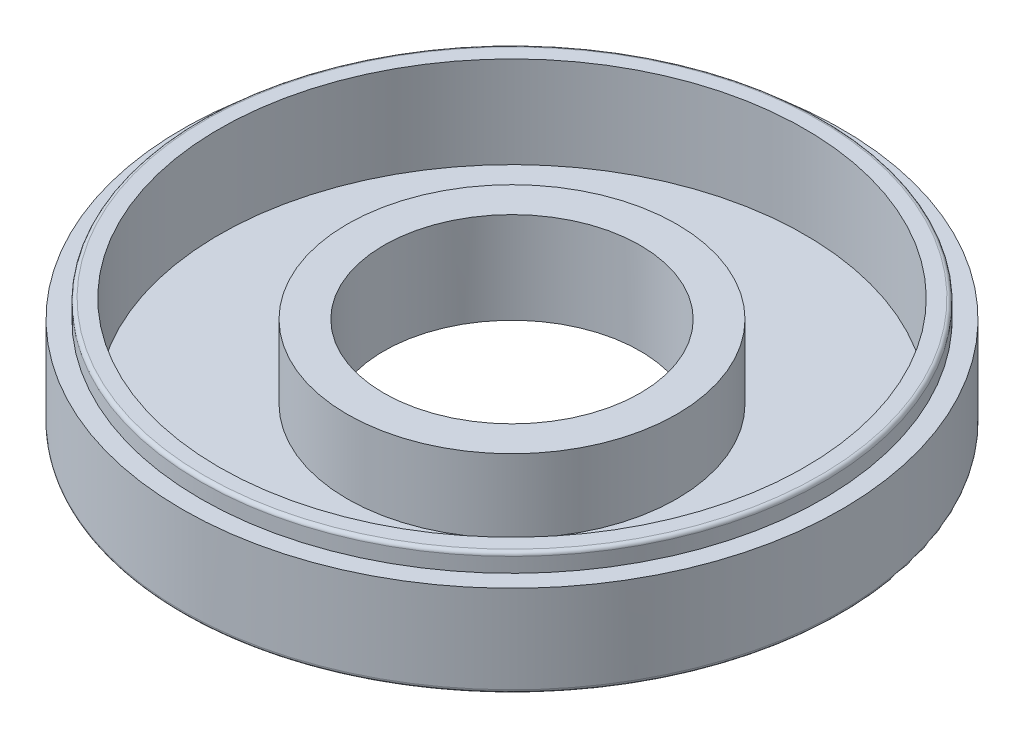
ISO-10303-21;
HEADER;
FILE_DESCRIPTION(('STEP AP214'),'2;1');
FILE_NAME('part.step','',(''),(''),'','','');
FILE_SCHEMA(('AUTOMOTIVE_DESIGN { 1 0 10303 214 1 1 1 1 }'));
ENDSEC;
DATA;
#1=APPLICATION_CONTEXT('core data for automotive mechanical design processes');
#2=APPLICATION_PROTOCOL_DEFINITION('international standard','automotive_design',2000,#1);
#3=PRODUCT_CONTEXT('',#1,'mechanical');
#4=PRODUCT('Part','Part','',(#3));
#5=PRODUCT_RELATED_PRODUCT_CATEGORY('part','',(#4));
#6=PRODUCT_DEFINITION_FORMATION('','',#4);
#7=PRODUCT_DEFINITION_CONTEXT('part definition',#1,'design');
#8=PRODUCT_DEFINITION('design','',#6,#7);
#9=PRODUCT_DEFINITION_SHAPE('','',#8);
#10=(LENGTH_UNIT() NAMED_UNIT(*) SI_UNIT(.MILLI.,.METRE.));
#11=(NAMED_UNIT(*) PLANE_ANGLE_UNIT() SI_UNIT($,.RADIAN.));
#12=(NAMED_UNIT(*) SI_UNIT($,.STERADIAN.) SOLID_ANGLE_UNIT());
#13=UNCERTAINTY_MEASURE_WITH_UNIT(LENGTH_MEASURE(1.E-05),#10,'distance_accuracy_value','');
#14=(GEOMETRIC_REPRESENTATION_CONTEXT(3) GLOBAL_UNCERTAINTY_ASSIGNED_CONTEXT((#13)) GLOBAL_UNIT_ASSIGNED_CONTEXT((#10,
#11,#12)) REPRESENTATION_CONTEXT('',''));
#15=CARTESIAN_POINT('',(0.,0.,0.));
#16=DIRECTION('',(0.,0.,1.));
#17=DIRECTION('',(1.,0.,0.));
#18=AXIS2_PLACEMENT_3D('',#15,#16,#17);
#19=CARTESIAN_POINT('',(0.,5.,0.));
#20=DIRECTION('',(0.,1.,0.));
#21=DIRECTION('',(0.,0.,1.));
#22=AXIS2_PLACEMENT_3D('',#19,#20,#21);
#23=CYLINDRICAL_SURFACE('',#22,44.9999999999995);
#24=CARTESIAN_POINT('',(0.,5.,0.));
#25=DIRECTION('',(0.,1.,0.));
#26=DIRECTION('',(0.,0.,1.));
#27=AXIS2_PLACEMENT_3D('',#24,#25,#26);
#28=CIRCLE('',#27,44.9999999999995);
#29=CARTESIAN_POINT('',(0.,5.,44.9999999999995));
#30=VERTEX_POINT('',#29);
#31=EDGE_CURVE('E122',#30,#30,#28,.T.);
#32=ORIENTED_EDGE('',*,*,#31,.T.);
#33=EDGE_LOOP('',(#32));
#34=FACE_BOUND('',#33,.T.);
#35=CARTESIAN_POINT('',(0.,25.,0.));
#36=DIRECTION('',(0.,1.,0.));
#37=DIRECTION('',(0.,0.,1.));
#38=AXIS2_PLACEMENT_3D('',#35,#36,#37);
#39=CIRCLE('',#38,44.9999999999995);
#40=CARTESIAN_POINT('',(0.,25.,44.9999999999995));
#41=VERTEX_POINT('',#40);
#42=EDGE_CURVE('E341',#41,#41,#39,.T.);
#43=ORIENTED_EDGE('',*,*,#42,.F.);
#44=EDGE_LOOP('',(#43));
#45=FACE_BOUND('',#44,.T.);
#46=ADVANCED_FACE('F51',(#34,#45),#23,.T.);
#47=CARTESIAN_POINT('',(2.32906465773737E-13,0.,2.17976899552867E-13));
#48=DIRECTION('',(0.,1.,0.));
#49=DIRECTION('',(0.,0.,1.));
#50=AXIS2_PLACEMENT_3D('',#47,#48,#49);
#51=CYLINDRICAL_SURFACE('',#50,34.9999999999991);
#52=CARTESIAN_POINT('',(2.32906465773737E-13,0.,2.17976899552867E-13));
#53=DIRECTION('',(0.,1.,0.));
#54=DIRECTION('',(0.,0.,1.));
#55=AXIS2_PLACEMENT_3D('',#52,#53,#54);
#56=CIRCLE('',#55,34.9999999999991);
#57=CARTESIAN_POINT('',(12.3951127626702,0.,-32.7316540920348));
#58=VERTEX_POINT('',#57);
#59=CARTESIAN_POINT('',(21.1450849832288,0.,-27.8905966420937));
#60=VERTEX_POINT('',#59);
#61=EDGE_CURVE('E112',#58,#60,#56,.T.);
#62=ORIENTED_EDGE('',*,*,#61,.F.);
#63=CARTESIAN_POINT('',(12.3951127626702,0.,-32.7316540920348));
#64=CARTESIAN_POINT('',(12.4484687607722,0.129276029627937,-32.7114457014059));
#65=CARTESIAN_POINT('',(12.5069391301364,0.256109112763818,-32.6891575529408));
#66=CARTESIAN_POINT('',(12.6335263452166,0.504022596320164,-32.6404451988197));
#67=CARTESIAN_POINT('',(12.7016422688342,0.625103545158873,-32.6140213885005));
#68=CARTESIAN_POINT('',(12.8468862104048,0.860569624154438,-32.5570818136111));
#69=CARTESIAN_POINT('',(12.9240064214296,0.974960427533291,-32.5265695904514));
#70=CARTESIAN_POINT('',(13.0866502314094,1.19637135688397,-32.46147346742));
#71=CARTESIAN_POINT('',(13.1721738385527,1.30339147567369,-32.4268895635811));
#72=CARTESIAN_POINT('',(13.3509197225474,1.50932310890023,-32.3537055861148));
#73=CARTESIAN_POINT('',(13.4441420558626,1.60823456385595,-32.3151054830314));
#74=CARTESIAN_POINT('',(13.637563700141,1.79729730739995,-32.2339550317877));
#75=CARTESIAN_POINT('',(13.7377654196398,1.88744554589833,-32.1914033182501));
#76=CARTESIAN_POINT('',(13.9443157931492,2.05831120722936,-32.10247181742));
#77=CARTESIAN_POINT('',(14.0506642287738,2.13902896480926,-32.0560921661048));
#78=CARTESIAN_POINT('',(14.2686756315274,2.29046670135772,-31.959648006746));
#79=CARTESIAN_POINT('',(14.3803385741531,2.36118672641653,-31.9095835156915));
#80=CARTESIAN_POINT('',(14.6084395089449,2.49230925651385,-31.8058050914774));
#81=CARTESIAN_POINT('',(14.7248902973485,2.55268153765926,-31.7520810873598));
#82=CARTESIAN_POINT('',(14.9613206565005,2.66239453176221,-31.6413639934016));
#83=CARTESIAN_POINT('',(15.0812989455342,2.71173919688736,-31.5843720839711));
#84=CARTESIAN_POINT('',(15.3238110915084,2.79901985339384,-31.4674263339365));
#85=CARTESIAN_POINT('',(15.4463430044665,2.83696420691504,-31.4074747020597));
#86=CARTESIAN_POINT('',(15.6930683051028,2.90118785194441,-31.2849256611057));
#87=CARTESIAN_POINT('',(15.8172609734952,2.92747203510712,-31.2223293736036));
#88=CARTESIAN_POINT('',(16.0481263762499,2.96519955668064,-31.1042100398117));
#89=CARTESIAN_POINT('',(16.1546970406201,2.9782542023827,-31.0489961829017));
#90=CARTESIAN_POINT('',(16.3676235476797,2.99565020992801,-30.9372818413949));
#91=CARTESIAN_POINT('',(16.4739794249956,3.00000755217866,-30.8807839097778));
#92=CARTESIAN_POINT('',(16.5800446336454,3.,-30.823726574609));
#93=B_SPLINE_CURVE_WITH_KNOTS('',3,(#63,#64,#65,#66,#67,#68,#69,#70,#71,#72,#73,#74,#75,#76,#77,
#78,#79,#80,#81,#82,#83,#84,#85,#86,#87,#88,#89,#90,#91,#92),.UNSPECIFIED.,.F.,.F.,(4,2,2,2,2,2,
2,2,2,2,2,2,2,2,4),(0.,0.423783034847252,0.847525584077967,1.27090342932024,1.694281687102,
2.11766305029728,2.54119125021047,2.96470441186563,3.38821562103129,3.81294349598829,
4.23751890850186,4.66178212992629,5.08586719647,5.447750024582,5.80896731558725),.UNSPECIFIED.);
#94=CARTESIAN_POINT('',(16.5800446336454,3.,-30.8237265746091));
#95=VERTEX_POINT('',#94);
#96=EDGE_CURVE('E318',#58,#95,#93,.T.);
#97=ORIENTED_EDGE('',*,*,#96,.T.);
#98=CARTESIAN_POINT('',(2.32906465773737E-13,3.,2.17976899552867E-13));
#99=DIRECTION('',(0.,1.,0.));
#100=DIRECTION('',(0.,0.,1.));
#101=AXIS2_PLACEMENT_3D('',#98,#99,#100);
#102=CIRCLE('',#101,34.9999999999991);
#103=CARTESIAN_POINT('',(17.3101715288134,3.,-30.4196969354232));
#104=VERTEX_POINT('',#103);
#105=EDGE_CURVE('E115',#95,#104,#102,.F.);
#106=ORIENTED_EDGE('',*,*,#105,.T.);
#107=CARTESIAN_POINT('',(17.3101715288134,3.,-30.4196969354232));
#108=CARTESIAN_POINT('',(17.4317974113366,3.00001589154164,-30.3504960209399));
#109=CARTESIAN_POINT('',(17.5529971504541,2.99412630081632,-30.2805530293558));
#110=CARTESIAN_POINT('',(17.7936975098551,2.97065351130556,-30.1397347605757));
#111=CARTESIAN_POINT('',(17.9131982752654,2.95307131750916,-30.0688595640167));
#112=CARTESIAN_POINT('',(18.1495282673635,2.90635965277069,-29.9268048996756));
#113=CARTESIAN_POINT('',(18.2663606263249,2.87724454363991,-29.8556259188366));
#114=CARTESIAN_POINT('',(18.4967219689307,2.80769146021013,-29.7134579929941));
#115=CARTESIAN_POINT('',(18.6102509706042,2.76725354772168,-29.6424690469554));
#116=CARTESIAN_POINT('',(18.833267829299,2.67535243401299,-29.5012787196624));
#117=CARTESIAN_POINT('',(18.9427555805255,2.62388894439648,-29.4310773590595));
#118=CARTESIAN_POINT('',(19.1570326287485,2.51029348948365,-29.2920538450206));
#119=CARTESIAN_POINT('',(19.2618202751615,2.44815781275293,-29.223232180727));
#120=CARTESIAN_POINT('',(19.4660193003271,2.31367348106804,-29.0876110820252));
#121=CARTESIAN_POINT('',(19.5654304592959,2.24132440903957,-29.0208117303356));
#122=CARTESIAN_POINT('',(19.7582824302941,2.08692563888873,-28.8898574470994));
#123=CARTESIAN_POINT('',(19.8517231949357,2.00487586378555,-28.8257025365435));
#124=CARTESIAN_POINT('',(20.0327346164249,1.83103153301315,-28.70020489425));
#125=CARTESIAN_POINT('',(20.1202589021726,1.73917194581539,-28.6388853542292));
#126=CARTESIAN_POINT('',(20.2881735738181,1.5468672569121,-28.5201785362313));
#127=CARTESIAN_POINT('',(20.3685663968752,1.44642511149186,-28.4627899164116));
#128=CARTESIAN_POINT('',(20.5217500581114,1.23769088256299,-28.3525426990866));
#129=CARTESIAN_POINT('',(20.5945456957124,1.12940382913542,-28.299681245437));
#130=CARTESIAN_POINT('',(20.7321630732249,0.905710881475214,-28.1990191142171));
#131=CARTESIAN_POINT('',(20.7969879121352,0.7903077802893,-28.1512164708252));
#132=CARTESIAN_POINT('',(20.9125507838426,0.564447709493236,-28.0654574886167));
#133=CARTESIAN_POINT('',(20.9640424432558,0.454566482893431,-28.0269969878339));
#134=CARTESIAN_POINT('',(21.0599122468518,0.230440501066544,-27.9550289898252));
#135=CARTESIAN_POINT('',(21.1043034795711,0.11620426665345,-27.9215123883756));
#136=CARTESIAN_POINT('',(21.1450849832288,0.,-27.8905966420937));
#137=B_SPLINE_CURVE_WITH_KNOTS('',3,(#107,#108,#109,#110,#111,#112,#113,#114,#115,#116,#117,
#118,#119,#120,#121,#122,#123,#124,#125,#126,#127,#128,#129,#130,#131,#132,#133,#134,#135,#136),
.UNSPECIFIED.,.F.,.F.,(4,2,2,2,2,2,2,2,2,2,2,2,2,2,4),(0.,0.419671653961475,0.839307241452767,
1.25842189600554,1.67753426267957,2.09665759342365,2.51592697765006,2.93521348812029,
3.3545033260997,3.77676913065431,4.19889006646679,4.62074269781777,5.0424307932698,
5.42395655795063,5.8047707258094),.UNSPECIFIED.);
#138=EDGE_CURVE('E102',#104,#60,#137,.T.);
#139=ORIENTED_EDGE('',*,*,#138,.T.);
#140=EDGE_LOOP('',(#62,#97,#106,#139));
#141=FACE_BOUND('',#140,.T.);
#142=CARTESIAN_POINT('',(2.32906465773737E-13,25.,2.17976899552867E-13));
#143=DIRECTION('',(0.,1.,0.));
#144=DIRECTION('',(0.,0.,1.));
#145=AXIS2_PLACEMENT_3D('',#142,#143,#144);
#146=CIRCLE('',#145,34.9999999999991);
#147=CARTESIAN_POINT('',(2.32906465773737E-13,25.,34.9999999999994));
#148=VERTEX_POINT('',#147);
#149=EDGE_CURVE('E55',#148,#148,#146,.F.);
#150=ORIENTED_EDGE('',*,*,#149,.F.);
#151=EDGE_LOOP('',(#150));
#152=FACE_BOUND('',#151,.T.);
#153=ADVANCED_FACE('F110',(#141,#152),#51,.F.);
#154=CARTESIAN_POINT('',(0.,30.,0.));
#155=DIRECTION('',(0.,-1.,0.));
#156=DIRECTION('',(0.,0.,-1.));
#157=AXIS2_PLACEMENT_3D('',#154,#155,#156);
#158=CYLINDRICAL_SURFACE('',#157,90.);
#159=CARTESIAN_POINT('',(43.5822055319173,3.,-78.7438337965184));
#160=CARTESIAN_POINT('',(43.4592223692715,3.00001523579065,-78.8119048537251));
#161=CARTESIAN_POINT('',(43.3360787169811,2.9940734299319,-78.8796809012287));
#162=CARTESIAN_POINT('',(43.0903599479878,2.97038721251025,-79.0141780664588));
#163=CARTESIAN_POINT('',(42.9677848009455,2.95264343825288,-79.0808992409492));
#164=CARTESIAN_POINT('',(42.7241870056725,2.90548563142727,-79.2127707779764));
#165=CARTESIAN_POINT('',(42.6031630786038,2.87608194864949,-79.2779224793818));
#166=CARTESIAN_POINT('',(42.363434518466,2.80582093005223,-79.4062837062947));
#167=CARTESIAN_POINT('',(42.2447298568596,2.76496373525749,-79.469493255705));
#168=CARTESIAN_POINT('',(42.0104804338637,2.6720783190651,-79.5935745471903));
#169=CARTESIAN_POINT('',(41.894936266597,2.62004801335091,-79.6544458505701));
#170=CARTESIAN_POINT('',(41.6678373635025,2.50517273736847,-79.773477874379));
#171=CARTESIAN_POINT('',(41.5562840295407,2.44232401108702,-79.831637644457));
#172=CARTESIAN_POINT('',(41.3380398896138,2.30627741058074,-79.9448658290049));
#173=CARTESIAN_POINT('',(41.2313486846048,2.23308038768926,-79.9999344972533));
#174=CARTESIAN_POINT('',(41.0236090537988,2.07685281801269,-80.1066610179069));
#175=CARTESIAN_POINT('',(40.9225606350811,1.9938222588909,-80.1583188660329));
#176=CARTESIAN_POINT('',(40.7266893232019,1.81836333246364,-80.2580144086565));
#177=CARTESIAN_POINT('',(40.6318775396095,1.72591890421697,-80.3060456643149));
#178=CARTESIAN_POINT('',(40.449416237118,1.53244161665669,-80.3981042494095));
#179=CARTESIAN_POINT('',(40.3617642287486,1.43141176765805,-80.4421329711424));
#180=CARTESIAN_POINT('',(40.1943009159083,1.22151762689052,-80.5259395426686));
#181=CARTESIAN_POINT('',(40.1144847817111,1.11265823355949,-80.5657200122627));
#182=CARTESIAN_POINT('',(39.9632651947625,0.887859678786872,-80.6408367982721));
#183=CARTESIAN_POINT('',(39.8918584039291,0.771923354463618,-80.6761748784686));
#184=CARTESIAN_POINT('',(39.7661912743911,0.548379638195814,-80.7381838457865));
#185=CARTESIAN_POINT('',(39.7109021168373,0.441495788376737,-80.7653861724415));
#186=CARTESIAN_POINT('',(39.6076101712924,0.223680391153764,-80.8160905157932));
#187=CARTESIAN_POINT('',(39.5595935488308,0.112757039891572,-80.8395995614388));
#188=CARTESIAN_POINT('',(39.5153114194194,0.,-80.861240179868));
#189=B_SPLINE_CURVE_WITH_KNOTS('',3,(#159,#160,#161,#162,#163,#164,#165,#166,#167,#168,#169,
#170,#171,#172,#173,#174,#175,#176,#177,#178,#179,#180,#181,#182,#183,#184,#185,#186,#187,#188),
.UNSPECIFIED.,.F.,.F.,(4,2,2,2,2,2,2,2,2,2,2,2,2,2,4),(0.,0.421565690964689,0.843108619257232,
1.26427820415102,1.68544260349847,2.10668563839326,2.52807521939633,2.94943015368533,
3.37078561659221,3.79287239416483,4.21481178088336,4.63648944604644,5.05799915835359,
5.42778864140511,5.79686559538389),.UNSPECIFIED.);
#190=CARTESIAN_POINT('',(43.5822055319173,3.,-78.7438337965184));
#191=VERTEX_POINT('',#190);
#192=CARTESIAN_POINT('',(40.0387008008399,1.00000000000001,-80.6033649308813));
#193=VERTEX_POINT('',#192);
#194=EDGE_CURVE('E309',#191,#193,#189,.T.);
#195=ORIENTED_EDGE('',*,*,#194,.T.);
#196=CARTESIAN_POINT('',(0.,1.,0.));
#197=DIRECTION('',(0.,1.,0.));
#198=DIRECTION('',(0.,0.,1.));
#199=AXIS2_PLACEMENT_3D('',#196,#197,#198);
#200=CIRCLE('',#199,90.);
#201=CARTESIAN_POINT('',(47.7481320788545,0.999999999999994,-76.2896839879434));
#202=VERTEX_POINT('',#201);
#203=EDGE_CURVE('E180',#193,#202,#200,.T.);
#204=ORIENTED_EDGE('',*,*,#203,.T.);
#205=CARTESIAN_POINT('',(48.2415563893468,0.,-75.9786301346206));
#206=CARTESIAN_POINT('',(48.1939954371257,0.128944274670405,-76.0088269028136));
#207=CARTESIAN_POINT('',(48.1417889855804,0.255494803599767,-76.0419133850985));
#208=CARTESIAN_POINT('',(48.028475338156,0.502935024862477,-76.1135342989408));
#209=CARTESIAN_POINT('',(47.9673686074365,0.623825012599301,-76.1520684457813));
#210=CARTESIAN_POINT('',(47.8366927460156,0.858988829159912,-76.2342230250002));
#211=CARTESIAN_POINT('',(47.7671305355399,0.97326795694504,-76.2778392968158));
#212=CARTESIAN_POINT('',(47.6199639118232,1.19450829013831,-76.3698014084832));
#213=CARTESIAN_POINT('',(47.5423595972649,1.3014695853152,-76.4181471902998));
#214=CARTESIAN_POINT('',(47.3796006885557,1.50733866120852,-76.5191649852966));
#215=CARTESIAN_POINT('',(47.2944445848305,1.60624482411975,-76.5718378632913));
#216=CARTESIAN_POINT('',(47.1171271581299,1.79531212271054,-76.6810744125435));
#217=CARTESIAN_POINT('',(47.0249634097839,1.88547020584917,-76.7376394302346));
#218=CARTESIAN_POINT('',(46.8342793071827,2.05635352251867,-76.8541655495134));
#219=CARTESIAN_POINT('',(46.7357596114886,2.13707973088915,-76.9141262991795));
#220=CARTESIAN_POINT('',(46.5330147876899,2.28853616865751,-77.0369559382531));
#221=CARTESIAN_POINT('',(46.4287896638053,2.35926640544865,-77.0998248255097));
#222=CARTESIAN_POINT('',(46.2152534027695,2.49027855304082,-77.2280122107303));
#223=CARTESIAN_POINT('',(46.1059383268676,2.55055219588806,-77.2933325978912));
#224=CARTESIAN_POINT('',(45.8830828203332,2.66013253214132,-77.4258323054388));
#225=CARTESIAN_POINT('',(45.76954388819,2.70944307240144,-77.4930109644414));
#226=CARTESIAN_POINT('',(45.5390590749425,2.79674296341114,-77.6286800558804));
#227=CARTESIAN_POINT('',(45.422115371808,2.83473938420617,-77.6971696405352));
#228=CARTESIAN_POINT('',(45.1856067316215,2.8991679923754,-77.8349514638489));
#229=CARTESIAN_POINT('',(45.0660428655311,2.92560481532419,-77.9042433693012));
#230=CARTESIAN_POINT('',(44.8405738667903,2.96410046656182,-78.0342079235404));
#231=CARTESIAN_POINT('',(44.7348864522342,2.97756971180497,-78.0948447368368));
#232=CARTESIAN_POINT('',(44.522897210274,2.99551470573675,-78.2158972336989));
#233=CARTESIAN_POINT('',(44.4165969613313,3.00000775268973,-78.276313118192));
#234=CARTESIAN_POINT('',(44.310165749441,3.,-78.3365126314484));
#235=B_SPLINE_CURVE_WITH_KNOTS('',3,(#205,#206,#207,#208,#209,#210,#211,#212,#213,#214,#215,
#216,#217,#218,#219,#220,#221,#222,#223,#224,#225,#226,#227,#228,#229,#230,#231,#232,#233,#234),
.UNSPECIFIED.,.F.,.F.,(4,2,2,2,2,2,2,2,2,2,2,2,2,2,4),(0.,0.422013213789404,0.84400437961119,
1.26565247130344,1.68729538965928,2.10902278366045,2.53089680929488,2.95272719312918,
3.37455726496596,3.79671936952457,4.21873310658122,4.6404825766661,5.0620627633385,
5.42950457038345,5.79623758509501),.UNSPECIFIED.);
#236=CARTESIAN_POINT('',(44.310165749441,3.,-78.3365126314484));
#237=VERTEX_POINT('',#236);
#238=EDGE_CURVE('E117',#202,#237,#235,.T.);
#239=ORIENTED_EDGE('',*,*,#238,.T.);
#240=CARTESIAN_POINT('',(0.,3.,0.));
#241=DIRECTION('',(0.,1.,0.));
#242=DIRECTION('',(0.,0.,1.));
#243=AXIS2_PLACEMENT_3D('',#240,#241,#242);
#244=CIRCLE('',#243,90.);
#245=EDGE_CURVE('E314',#237,#191,#244,.T.);
#246=ORIENTED_EDGE('',*,*,#245,.T.);
#247=EDGE_LOOP('',(#195,#204,#239,#246));
#248=FACE_BOUND('',#247,.T.);
#249=CARTESIAN_POINT('',(-1.48353551665537E-11,25.,-1.2490009027033E-13));
#250=DIRECTION('',(0.,1.,0.));
#251=DIRECTION('',(0.,0.,1.));
#252=AXIS2_PLACEMENT_3D('',#249,#250,#251);
#253=CIRCLE('',#252,89.9999999999917);
#254=CARTESIAN_POINT('',(-1.48353551665537E-11,25.,89.9999999999915));
#255=VERTEX_POINT('',#254);
#256=EDGE_CURVE('E123',#255,#255,#253,.T.);
#257=ORIENTED_EDGE('',*,*,#256,.F.);
#258=EDGE_LOOP('',(#257));
#259=FACE_BOUND('',#258,.T.);
#260=ADVANCED_FACE('F166',(#248,#259),#158,.T.);
#261=CARTESIAN_POINT('',(0.,30.,0.));
#262=DIRECTION('',(0.,1.,0.));
#263=DIRECTION('',(0.,0.,1.));
#264=AXIS2_PLACEMENT_3D('',#261,#262,#263);
#265=PLANE('',#264);
#266=CARTESIAN_POINT('',(-1.48353551665537E-11,30.,-1.2490009027033E-13));
#267=DIRECTION('',(0.,1.,0.));
#268=DIRECTION('',(0.,0.,1.));
#269=AXIS2_PLACEMENT_3D('',#266,#267,#268);
#270=CIRCLE('',#269,83.9999999999852);
#271=CARTESIAN_POINT('',(-1.48353551665537E-11,30.,83.9999999999851));
#272=VERTEX_POINT('',#271);
#273=EDGE_CURVE('E61',#272,#272,#270,.T.);
#274=ORIENTED_EDGE('',*,*,#273,.T.);
#275=EDGE_LOOP('',(#274));
#276=FACE_BOUND('',#275,.T.);
#277=CARTESIAN_POINT('',(0.,30.,0.));
#278=DIRECTION('',(0.,1.,0.));
#279=DIRECTION('',(0.,0.,1.));
#280=AXIS2_PLACEMENT_3D('',#277,#278,#279);
#281=CIRCLE('',#280,80.);
#282=CARTESIAN_POINT('',(0.,30.,80.));
#283=VERTEX_POINT('',#282);
#284=EDGE_CURVE('E128',#283,#283,#281,.T.);
#285=ORIENTED_EDGE('',*,*,#284,.F.);
#286=EDGE_LOOP('',(#285));
#287=FACE_BOUND('',#286,.T.);
#288=ADVANCED_FACE('F199',(#276,#287),#265,.T.);
#289=CARTESIAN_POINT('',(0.,0.,0.));
#290=DIRECTION('',(0.,1.,0.));
#291=DIRECTION('',(0.,0.,1.));
#292=AXIS2_PLACEMENT_3D('',#289,#290,#291);
#293=PLANE('',#292);
#294=DIRECTION('',(-0.490907288805725,0.,0.871211819133219));
#295=VECTOR('',#294,1.);
#296=CARTESIAN_POINT('',(52.0070291612452,0.,-82.6612043361222));
#297=LINE('',#296,#295);
#298=CARTESIAN_POINT('',(47.7499620353006,0.,-75.1061989826895));
#299=VERTEX_POINT('',#298);
#300=EDGE_CURVE('E98',#299,#60,#297,.T.);
#301=ORIENTED_EDGE('',*,*,#300,.F.);
#302=CARTESIAN_POINT('',(0.,0.,0.));
#303=DIRECTION('',(0.,1.,0.));
#304=DIRECTION('',(0.,0.,1.));
#305=AXIS2_PLACEMENT_3D('',#302,#303,#304);
#306=CIRCLE('',#305,89.);
#307=CARTESIAN_POINT('',(39.0235466689867,0.,-79.9885167094216));
#308=VERTEX_POINT('',#307);
#309=EDGE_CURVE('E68',#299,#308,#306,.F.);
#310=ORIENTED_EDGE('',*,*,#309,.T.);
#311=DIRECTION('',(0.49091159386535,0.,-0.871209393319759));
#312=VECTOR('',#311,1.);
#313=CARTESIAN_POINT('',(43.3347077303076,0.,-87.6394340225852));
#314=LINE('',#313,#312);
#315=EDGE_CURVE('E106',#58,#308,#314,.T.);
#316=ORIENTED_EDGE('',*,*,#315,.F.);
#317=ORIENTED_EDGE('',*,*,#61,.T.);
#318=EDGE_LOOP('',(#301,#310,#316,#317));
#319=FACE_BOUND('',#318,.T.);
#320=ADVANCED_FACE('F120',(#319),#293,.F.);
#321=CARTESIAN_POINT('',(0.,5.,0.));
#322=DIRECTION('',(0.,1.,0.));
#323=DIRECTION('',(0.,0.,1.));
#324=AXIS2_PLACEMENT_3D('',#321,#322,#323);
#325=CYLINDRICAL_SURFACE('',#324,80.);
#326=CARTESIAN_POINT('',(0.,5.,0.));
#327=DIRECTION('',(0.,1.,0.));
#328=DIRECTION('',(0.,0.,1.));
#329=AXIS2_PLACEMENT_3D('',#326,#327,#328);
#330=CIRCLE('',#329,80.);
#331=CARTESIAN_POINT('',(0.,5.,80.));
#332=VERTEX_POINT('',#331);
#333=EDGE_CURVE('E135',#332,#332,#330,.T.);
#334=ORIENTED_EDGE('',*,*,#333,.F.);
#335=EDGE_LOOP('',(#334));
#336=FACE_BOUND('',#335,.T.);
#337=ORIENTED_EDGE('',*,*,#284,.T.);
#338=EDGE_LOOP('',(#337));
#339=FACE_BOUND('',#338,.T.);
#340=ADVANCED_FACE('F223',(#336,#339),#325,.F.);
#341=CARTESIAN_POINT('',(0.,5.,0.));
#342=DIRECTION('',(0.,1.,0.));
#343=DIRECTION('',(0.,0.,1.));
#344=AXIS2_PLACEMENT_3D('',#341,#342,#343);
#345=PLANE('',#344);
#346=ORIENTED_EDGE('',*,*,#31,.F.);
#347=EDGE_LOOP('',(#346));
#348=FACE_BOUND('',#347,.T.);
#349=ORIENTED_EDGE('',*,*,#333,.T.);
#350=EDGE_LOOP('',(#349));
#351=FACE_BOUND('',#350,.T.);
#352=ADVANCED_FACE('F219',(#348,#351),#345,.T.);
#353=CARTESIAN_POINT('',(-1.48353551665537E-11,25.,-1.2490009027033E-13));
#354=DIRECTION('',(0.,1.,0.));
#355=DIRECTION('',(0.,0.,1.));
#356=AXIS2_PLACEMENT_3D('',#353,#354,#355);
#357=PLANE('',#356);
#358=CARTESIAN_POINT('',(-1.48353551665537E-11,25.,-1.2490009027033E-13));
#359=DIRECTION('',(0.,1.,0.));
#360=DIRECTION('',(0.,0.,1.));
#361=AXIS2_PLACEMENT_3D('',#358,#359,#360);
#362=CIRCLE('',#361,84.9999999999852);
#363=CARTESIAN_POINT('',(-1.48353551665537E-11,25.,84.9999999999851));
#364=VERTEX_POINT('',#363);
#365=EDGE_CURVE('E131',#364,#364,#362,.T.);
#366=ORIENTED_EDGE('',*,*,#365,.F.);
#367=EDGE_LOOP('',(#366));
#368=FACE_BOUND('',#367,.T.);
#369=ORIENTED_EDGE('',*,*,#256,.T.);
#370=EDGE_LOOP('',(#369));
#371=FACE_BOUND('',#370,.T.);
#372=ADVANCED_FACE('F222',(#368,#371),#357,.T.);
#373=CARTESIAN_POINT('',(-1.48353551665537E-11,25.,-1.2490009027033E-13));
#374=DIRECTION('',(0.,1.,0.));
#375=DIRECTION('',(0.,0.,1.));
#376=AXIS2_PLACEMENT_3D('',#373,#374,#375);
#377=CYLINDRICAL_SURFACE('',#376,84.9999999999852);
#378=CARTESIAN_POINT('',(-1.48353551665537E-11,29.,-1.2490009027033E-13));
#379=DIRECTION('',(0.,1.,0.));
#380=DIRECTION('',(0.,0.,1.));
#381=AXIS2_PLACEMENT_3D('',#378,#379,#380);
#382=CIRCLE('',#381,84.9999999999852);
#383=CARTESIAN_POINT('',(-1.48353551665537E-11,29.,84.9999999999851));
#384=VERTEX_POINT('',#383);
#385=EDGE_CURVE('E12',#384,#384,#382,.F.);
#386=ORIENTED_EDGE('',*,*,#385,.T.);
#387=EDGE_LOOP('',(#386));
#388=FACE_BOUND('',#387,.T.);
#389=ORIENTED_EDGE('',*,*,#365,.T.);
#390=EDGE_LOOP('',(#389));
#391=FACE_BOUND('',#390,.T.);
#392=ADVANCED_FACE('F263',(#388,#391),#377,.T.);
#393=CARTESIAN_POINT('',(0.,3.,0.));
#394=DIRECTION('',(0.,1.,0.));
#395=DIRECTION('',(0.,0.,1.));
#396=AXIS2_PLACEMENT_3D('',#393,#394,#395);
#397=PLANE('',#396);
#398=ORIENTED_EDGE('',*,*,#105,.F.);
#399=DIRECTION('',(0.49091159386535,0.,-0.871209393319759));
#400=VECTOR('',#399,1.);
#401=CARTESIAN_POINT('',(-0.598550574622221,3.,-0.337273012492612));
#402=LINE('',#401,#400);
#403=EDGE_CURVE('E319',#95,#191,#402,.T.);
#404=ORIENTED_EDGE('',*,*,#403,.T.);
#405=ORIENTED_EDGE('',*,*,#245,.F.);
#406=DIRECTION('',(-0.490907288805725,0.,0.871211819133219));
#407=VECTOR('',#406,1.);
#408=CARTESIAN_POINT('',(0.128569152394118,3.,0.0724456815664426));
#409=LINE('',#408,#407);
#410=EDGE_CURVE('E118',#237,#104,#409,.T.);
#411=ORIENTED_EDGE('',*,*,#410,.T.);
#412=EDGE_LOOP('',(#398,#404,#405,#411));
#413=FACE_BOUND('',#412,.T.);
#414=ADVANCED_FACE('F165',(#413),#397,.F.);
#415=CARTESIAN_POINT('',(48.014635053727,-2.,-84.9108241462799));
#416=DIRECTION('',(-0.490907288805725,0.,0.871211819133219));
#417=DIRECTION('',(0.871211819133219,0.,0.490907288805725));
#418=AXIS2_PLACEMENT_3D('',#415,#416,#417);
#419=CYLINDRICAL_SURFACE('',#418,5.);
#420=ORIENTED_EDGE('',*,*,#238,.F.);
#421=CARTESIAN_POINT('',(47.7481320788545,1.,-76.2896839879434));
#422=CARTESIAN_POINT('',(47.7697586861817,0.96602935835523,-76.2761492171974));
#423=CARTESIAN_POINT('',(47.790136683866,0.931751830099868,-76.2613383969375));
#424=CARTESIAN_POINT('',(47.8281868485961,0.862853829009373,-76.2290856894942));
#425=CARTESIAN_POINT('',(47.8458546528183,0.828232896786865,-76.2116396479316));
#426=CARTESIAN_POINT('',(47.8782683249791,0.758894579803112,-76.174007226171));
#427=CARTESIAN_POINT('',(47.8930025538452,0.724177344033574,-76.1538104454629));
#428=CARTESIAN_POINT('',(47.9192229442838,0.655235354223201,-76.1107242825236));
#429=CARTESIAN_POINT('',(47.9307116000942,0.621010241288227,-76.0878369872272));
#430=CARTESIAN_POINT('',(47.9549723571392,0.537179011838102,-76.0276351812322));
#431=CARTESIAN_POINT('',(47.9656906321114,0.488116605573999,-75.9886866399409));
#432=CARTESIAN_POINT('',(47.9790727079402,0.393996273784071,-75.9051814987192));
#433=CARTESIAN_POINT('',(47.9817559327105,0.348928947165001,-75.8606386946634));
#434=CARTESIAN_POINT('',(47.9789846115926,0.264424910093062,-75.7662053851264));
#435=CARTESIAN_POINT('',(47.9734828535964,0.225022315110906,-75.7162854070712));
#436=CARTESIAN_POINT('',(47.9545105014071,0.154214549476505,-75.6123496293028));
#437=CARTESIAN_POINT('',(47.9410354082214,0.122813908287473,-75.5583315322198));
#438=CARTESIAN_POINT('',(47.9084914194583,0.0724813036524699,-75.453223661937));
#439=CARTESIAN_POINT('',(47.8900964125432,0.0526318414455868,-75.4023622524829));
#440=CARTESIAN_POINT('',(47.8481402192732,0.0220498609410643,-75.3001038379695));
#441=CARTESIAN_POINT('',(47.8245913177595,0.011295954035004,-75.2487083787473));
#442=CARTESIAN_POINT('',(47.7911448443193,0.00359424230479387,-75.1824846201989));
#443=CARTESIAN_POINT('',(47.7831573716952,0.00224699623185819,-75.1671096012843));
#444=CARTESIAN_POINT('',(47.76682512375,0.000451150083437823,-75.136526633887));
#445=CARTESIAN_POINT('',(47.7584808917005,1.23008561629626E-06,-75.1213184727863));
#446=CARTESIAN_POINT('',(47.749962035301,0.,-75.1061989826893));
#447=B_SPLINE_CURVE_WITH_KNOTS('',3,(#421,#422,#423,#424,#425,#426,#427,#428,#429,#430,#431,
#432,#433,#434,#435,#436,#437,#438,#439,#440,#441,#442,#443,#444,#445,#446),.UNSPECIFIED.,.F.,
.F.,(4,2,2,2,2,2,2,2,2,2,2,2,4),(0.,0.127438079915865,0.255079201949342,0.383217072793447,
0.511256199526406,0.701054058439606,0.890392728516383,1.08082777294166,1.27137037386195,
1.44332590976363,1.61487595124433,1.6669916587246,1.71903064986684),.UNSPECIFIED.);
#448=EDGE_CURVE('E76',#202,#299,#447,.T.);
#449=ORIENTED_EDGE('',*,*,#448,.T.);
#450=ORIENTED_EDGE('',*,*,#300,.T.);
#451=ORIENTED_EDGE('',*,*,#138,.F.);
#452=ORIENTED_EDGE('',*,*,#410,.F.);
#453=EDGE_LOOP('',(#420,#449,#450,#451,#452));
#454=FACE_BOUND('',#453,.T.);
#455=ADVANCED_FACE('F100',(#454),#419,.F.);
#456=CARTESIAN_POINT('',(47.3270907213519,-2.,-85.3897944841658));
#457=DIRECTION('',(0.49091159386535,0.,-0.871209393319759));
#458=DIRECTION('',(-0.871209393319759,0.,-0.49091159386535));
#459=AXIS2_PLACEMENT_3D('',#456,#457,#458);
#460=CYLINDRICAL_SURFACE('',#459,5.);
#461=ORIENTED_EDGE('',*,*,#315,.T.);
#462=CARTESIAN_POINT('',(39.0235466689867,0.,-79.9885167094216));
#463=CARTESIAN_POINT('',(39.0366775594459,-9.09101585492348E-07,-80.0118176752619));
#464=CARTESIAN_POINT('',(39.0502063042982,0.00106999982524336,-80.0348779880236));
#465=CARTESIAN_POINT('',(39.0779694868681,0.00532150722264377,-80.0803629196226));
#466=CARTESIAN_POINT('',(39.0922037432179,0.00850156606400724,-80.1027876995322));
#467=CARTESIAN_POINT('',(39.1357299820506,0.0211234363494936,-80.1687279939059));
#468=CARTESIAN_POINT('',(39.1659462686689,0.0336475044416529,-80.2110882636935));
#469=CARTESIAN_POINT('',(39.2280228934953,0.0662951195847665,-80.2913576823025));
#470=CARTESIAN_POINT('',(39.2598824222273,0.0864149551844857,-80.3292689931386));
#471=CARTESIAN_POINT('',(39.3246431894658,0.133366802756188,-80.3996809600893));
#472=CARTESIAN_POINT('',(39.3575449097399,0.160201959725722,-80.4321790691186));
#473=CARTESIAN_POINT('',(39.4249888347101,0.220533081463514,-80.4919959918109));
#474=CARTESIAN_POINT('',(39.4595479527806,0.254230714312371,-80.5190915112194));
#475=CARTESIAN_POINT('',(39.5286477211231,0.326297257768029,-80.566075624269));
#476=CARTESIAN_POINT('',(39.5631883721495,0.36466596015458,-80.5859645389988));
#477=CARTESIAN_POINT('',(39.6346927275774,0.448060022746517,-80.6196735838102));
#478=CARTESIAN_POINT('',(39.6716201846259,0.49337351103605,-80.6328546617303));
#479=CARTESIAN_POINT('',(39.7446126808163,0.586393146659721,-80.6506545841983));
#480=CARTESIAN_POINT('',(39.7806762427585,0.634103012655729,-80.6552596708894));
#481=CARTESIAN_POINT('',(39.8549812953988,0.735109846560483,-80.6563227903513));
#482=CARTESIAN_POINT('',(39.8930990409285,0.788503132204639,-80.6519553821467));
#483=CARTESIAN_POINT('',(39.9673935227312,0.894863326242847,-80.6341940282361));
#484=CARTESIAN_POINT('',(40.0035768115075,0.947831079034319,-80.6208329549303));
#485=CARTESIAN_POINT('',(40.0387008008399,1.,-80.6033649308813));
#486=B_SPLINE_CURVE_WITH_KNOTS('',3,(#462,#463,#464,#465,#466,#467,#468,#469,#470,#471,#472,
#473,#474,#475,#476,#477,#478,#479,#480,#481,#482,#483,#484,#485),.UNSPECIFIED.,.F.,.F.,(4,2,2,
2,2,2,2,2,2,2,2,4),(0.,0.0801852796608751,0.160350051706162,0.320071956307074,0.479715918234884,
0.639434786868679,0.804791081010732,0.970140006833784,1.14918338356983,1.328513740339,
1.52507735029957,1.7209263814735),.UNSPECIFIED.);
#487=EDGE_CURVE('E188',#308,#193,#486,.T.);
#488=ORIENTED_EDGE('',*,*,#487,.T.);
#489=ORIENTED_EDGE('',*,*,#194,.F.);
#490=ORIENTED_EDGE('',*,*,#403,.F.);
#491=ORIENTED_EDGE('',*,*,#96,.F.);
#492=EDGE_LOOP('',(#461,#488,#489,#490,#491));
#493=FACE_BOUND('',#492,.T.);
#494=ADVANCED_FACE('F164',(#493),#460,.F.);
#495=CARTESIAN_POINT('',(0.,1.,0.));
#496=DIRECTION('',(0.,1.,0.));
#497=DIRECTION('',(0.,0.,1.));
#498=AXIS2_PLACEMENT_3D('',#495,#496,#497);
#499=TOROIDAL_SURFACE('',#498,89.,1.);
#500=ORIENTED_EDGE('',*,*,#487,.F.);
#501=ORIENTED_EDGE('',*,*,#309,.F.);
#502=ORIENTED_EDGE('',*,*,#448,.F.);
#503=ORIENTED_EDGE('',*,*,#203,.F.);
#504=EDGE_LOOP('',(#500,#501,#502,#503));
#505=FACE_BOUND('',#504,.T.);
#506=ADVANCED_FACE('F183',(#505),#499,.T.);
#507=CARTESIAN_POINT('',(-1.48353551665537E-11,29.,-1.2490009027033E-13));
#508=DIRECTION('',(0.,1.,0.));
#509=DIRECTION('',(0.,0.,1.));
#510=AXIS2_PLACEMENT_3D('',#507,#508,#509);
#511=TOROIDAL_SURFACE('',#510,83.9999999999852,1.);
#512=ORIENTED_EDGE('',*,*,#385,.F.);
#513=EDGE_LOOP('',(#512));
#514=FACE_BOUND('',#513,.T.);
#515=ORIENTED_EDGE('',*,*,#273,.F.);
#516=EDGE_LOOP('',(#515));
#517=FACE_BOUND('',#516,.T.);
#518=ADVANCED_FACE('F53',(#514,#517),#511,.T.);
#519=CARTESIAN_POINT('',(0.,25.,0.));
#520=DIRECTION('',(0.,1.,0.));
#521=DIRECTION('',(0.,0.,1.));
#522=AXIS2_PLACEMENT_3D('',#519,#520,#521);
#523=PLANE('',#522);
#524=ORIENTED_EDGE('',*,*,#42,.T.);
#525=EDGE_LOOP('',(#524));
#526=FACE_BOUND('',#525,.T.);
#527=ORIENTED_EDGE('',*,*,#149,.T.);
#528=EDGE_LOOP('',(#527));
#529=FACE_BOUND('',#528,.T.);
#530=ADVANCED_FACE('F203',(#526,#529),#523,.T.);
#531=CLOSED_SHELL('',(#46,#153,#260,#288,#320,#340,#352,#372,#392,#414,#455,#494,#506,#518,#530));
#532=MANIFOLD_SOLID_BREP('B2',#531);
#533=ADVANCED_BREP_SHAPE_REPRESENTATION('',(#18,#532),#14);
#534=SHAPE_DEFINITION_REPRESENTATION(#9,#533);
ENDSEC;
END-ISO-10303-21;
